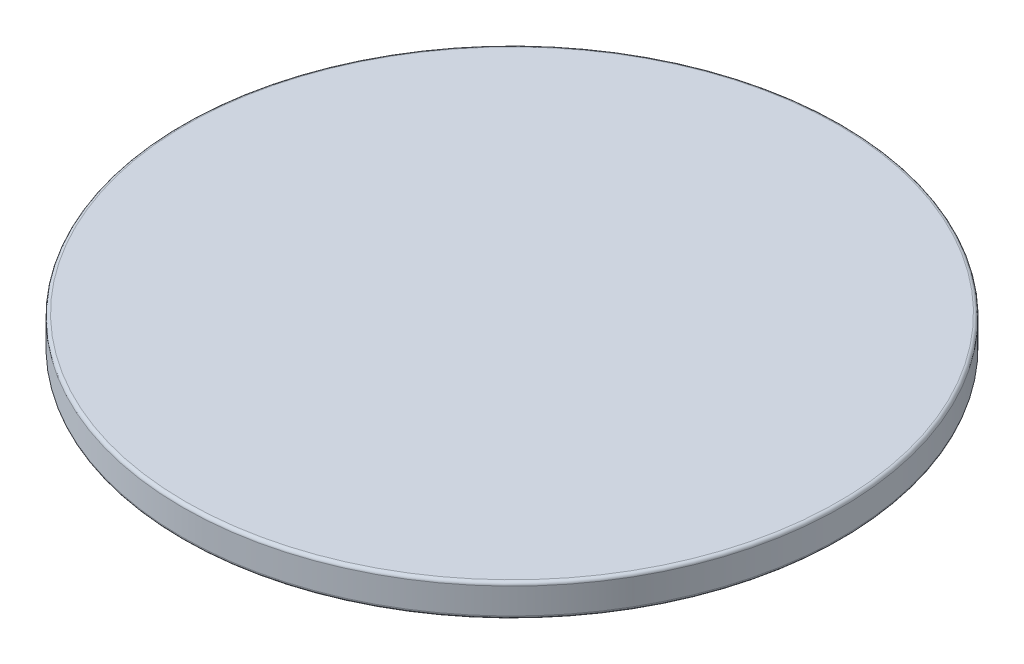
ISO-10303-21;
HEADER;
FILE_DESCRIPTION(('STEP AP214'),'2;1');
FILE_NAME('part.step','',(''),(''),'','','');
FILE_SCHEMA(('AUTOMOTIVE_DESIGN { 1 0 10303 214 1 1 1 1 }'));
ENDSEC;
DATA;
#1=APPLICATION_CONTEXT('core data for automotive mechanical design processes');
#2=APPLICATION_PROTOCOL_DEFINITION('international standard','automotive_design',2000,#1);
#3=PRODUCT_CONTEXT('',#1,'mechanical');
#4=PRODUCT('Part','Part','',(#3));
#5=PRODUCT_RELATED_PRODUCT_CATEGORY('part','',(#4));
#6=PRODUCT_DEFINITION_FORMATION('','',#4);
#7=PRODUCT_DEFINITION_CONTEXT('part definition',#1,'design');
#8=PRODUCT_DEFINITION('design','',#6,#7);
#9=PRODUCT_DEFINITION_SHAPE('','',#8);
#10=(LENGTH_UNIT() NAMED_UNIT(*) SI_UNIT(.MILLI.,.METRE.));
#11=(NAMED_UNIT(*) PLANE_ANGLE_UNIT() SI_UNIT($,.RADIAN.));
#12=(NAMED_UNIT(*) SI_UNIT($,.STERADIAN.) SOLID_ANGLE_UNIT());
#13=UNCERTAINTY_MEASURE_WITH_UNIT(LENGTH_MEASURE(1.E-05),#10,'distance_accuracy_value','');
#14=(GEOMETRIC_REPRESENTATION_CONTEXT(3) GLOBAL_UNCERTAINTY_ASSIGNED_CONTEXT((#13)) GLOBAL_UNIT_ASSIGNED_CONTEXT((#10,
#11,#12)) REPRESENTATION_CONTEXT('',''));
#15=CARTESIAN_POINT('',(0.,0.,0.));
#16=DIRECTION('',(0.,0.,1.));
#17=DIRECTION('',(1.,0.,0.));
#18=AXIS2_PLACEMENT_3D('',#15,#16,#17);
#19=CARTESIAN_POINT('',(0.,6.35,0.));
#20=DIRECTION('',(0.,-1.,0.));
#21=DIRECTION('',(0.,0.,-1.));
#22=AXIS2_PLACEMENT_3D('',#19,#20,#21);
#23=CYLINDRICAL_SURFACE('',#22,64.77);
#24=CARTESIAN_POINT('',(0.,0.635,0.));
#25=DIRECTION('',(0.,1.,0.));
#26=DIRECTION('',(0.,0.,1.));
#27=AXIS2_PLACEMENT_3D('',#24,#25,#26);
#28=CIRCLE('',#27,64.77);
#29=CARTESIAN_POINT('',(0.,0.635,64.77));
#30=VERTEX_POINT('',#29);
#31=EDGE_CURVE('E44',#30,#30,#28,.T.);
#32=ORIENTED_EDGE('',*,*,#31,.T.);
#33=EDGE_LOOP('',(#32));
#34=FACE_BOUND('',#33,.T.);
#35=CARTESIAN_POINT('',(0.,5.715,0.));
#36=DIRECTION('',(0.,1.,0.));
#37=DIRECTION('',(0.,0.,1.));
#38=AXIS2_PLACEMENT_3D('',#35,#36,#37);
#39=CIRCLE('',#38,64.77);
#40=CARTESIAN_POINT('',(0.,5.715,64.77));
#41=VERTEX_POINT('',#40);
#42=EDGE_CURVE('E48',#41,#41,#39,.F.);
#43=ORIENTED_EDGE('',*,*,#42,.T.);
#44=EDGE_LOOP('',(#43));
#45=FACE_BOUND('',#44,.T.);
#46=ADVANCED_FACE('F33',(#34,#45),#23,.T.);
#47=CARTESIAN_POINT('',(0.,6.35,0.));
#48=DIRECTION('',(0.,1.,0.));
#49=DIRECTION('',(0.,0.,1.));
#50=AXIS2_PLACEMENT_3D('',#47,#48,#49);
#51=PLANE('',#50);
#52=CARTESIAN_POINT('',(0.,6.35,0.));
#53=DIRECTION('',(0.,1.,0.));
#54=DIRECTION('',(0.,0.,1.));
#55=AXIS2_PLACEMENT_3D('',#52,#53,#54);
#56=CIRCLE('',#55,64.135);
#57=CARTESIAN_POINT('',(0.,6.35,64.135));
#58=VERTEX_POINT('',#57);
#59=EDGE_CURVE('E10',#58,#58,#56,.T.);
#60=ORIENTED_EDGE('',*,*,#59,.T.);
#61=EDGE_LOOP('',(#60));
#62=FACE_BOUND('',#61,.T.);
#63=ADVANCED_FACE('F64',(#62),#51,.T.);
#64=CARTESIAN_POINT('',(0.,0.,0.));
#65=DIRECTION('',(0.,1.,0.));
#66=DIRECTION('',(0.,0.,1.));
#67=AXIS2_PLACEMENT_3D('',#64,#65,#66);
#68=PLANE('',#67);
#69=CARTESIAN_POINT('',(0.,0.,0.));
#70=DIRECTION('',(0.,1.,0.));
#71=DIRECTION('',(0.,0.,1.));
#72=AXIS2_PLACEMENT_3D('',#69,#70,#71);
#73=CIRCLE('',#72,64.135);
#74=CARTESIAN_POINT('',(0.,0.,64.135));
#75=VERTEX_POINT('',#74);
#76=EDGE_CURVE('E40',#75,#75,#73,.F.);
#77=ORIENTED_EDGE('',*,*,#76,.T.);
#78=EDGE_LOOP('',(#77));
#79=FACE_BOUND('',#78,.T.);
#80=ADVANCED_FACE('F61',(#79),#68,.F.);
#81=CARTESIAN_POINT('',(0.,0.635,0.));
#82=DIRECTION('',(0.,1.,0.));
#83=DIRECTION('',(0.,0.,1.));
#84=AXIS2_PLACEMENT_3D('',#81,#82,#83);
#85=TOROIDAL_SURFACE('',#84,64.135,0.635);
#86=ORIENTED_EDGE('',*,*,#76,.F.);
#87=EDGE_LOOP('',(#86));
#88=FACE_BOUND('',#87,.T.);
#89=ORIENTED_EDGE('',*,*,#31,.F.);
#90=EDGE_LOOP('',(#89));
#91=FACE_BOUND('',#90,.T.);
#92=ADVANCED_FACE('F57',(#88,#91),#85,.T.);
#93=CARTESIAN_POINT('',(0.,5.715,0.));
#94=DIRECTION('',(0.,1.,0.));
#95=DIRECTION('',(0.,0.,1.));
#96=AXIS2_PLACEMENT_3D('',#93,#94,#95);
#97=TOROIDAL_SURFACE('',#96,64.135,0.635);
#98=ORIENTED_EDGE('',*,*,#42,.F.);
#99=EDGE_LOOP('',(#98));
#100=FACE_BOUND('',#99,.T.);
#101=ORIENTED_EDGE('',*,*,#59,.F.);
#102=EDGE_LOOP('',(#101));
#103=FACE_BOUND('',#102,.T.);
#104=ADVANCED_FACE('F35',(#100,#103),#97,.T.);
#105=CLOSED_SHELL('',(#46,#63,#80,#92,#104));
#106=MANIFOLD_SOLID_BREP('B2',#105);
#107=ADVANCED_BREP_SHAPE_REPRESENTATION('',(#18,#106),#14);
#108=SHAPE_DEFINITION_REPRESENTATION(#9,#107);
ENDSEC;
END-ISO-10303-21;
